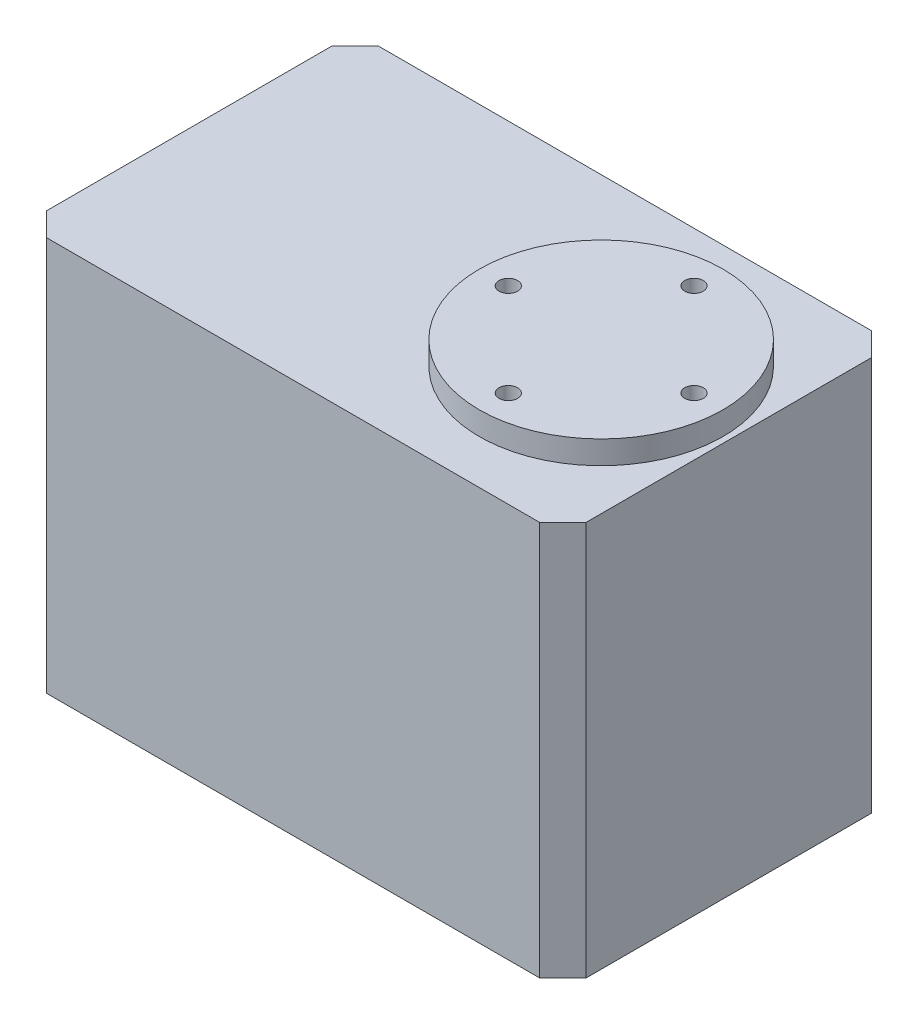
ISO-10303-21;
HEADER;
FILE_DESCRIPTION(('STEP AP214'),'2;1');
FILE_NAME('part.step','',(''),(''),'','','');
FILE_SCHEMA(('AUTOMOTIVE_DESIGN { 1 0 10303 214 1 1 1 1 }'));
ENDSEC;
DATA;
#1=APPLICATION_CONTEXT('core data for automotive mechanical design processes');
#2=APPLICATION_PROTOCOL_DEFINITION('international standard','automotive_design',2000,#1);
#3=PRODUCT_CONTEXT('',#1,'mechanical');
#4=PRODUCT('Part','Part','',(#3));
#5=PRODUCT_RELATED_PRODUCT_CATEGORY('part','',(#4));
#6=PRODUCT_DEFINITION_FORMATION('','',#4);
#7=PRODUCT_DEFINITION_CONTEXT('part definition',#1,'design');
#8=PRODUCT_DEFINITION('design','',#6,#7);
#9=PRODUCT_DEFINITION_SHAPE('','',#8);
#10=(LENGTH_UNIT() NAMED_UNIT(*) SI_UNIT(.MILLI.,.METRE.));
#11=(NAMED_UNIT(*) PLANE_ANGLE_UNIT() SI_UNIT($,.RADIAN.));
#12=(NAMED_UNIT(*) SI_UNIT($,.STERADIAN.) SOLID_ANGLE_UNIT());
#13=UNCERTAINTY_MEASURE_WITH_UNIT(LENGTH_MEASURE(1.E-05),#10,'distance_accuracy_value','');
#14=(GEOMETRIC_REPRESENTATION_CONTEXT(3) GLOBAL_UNCERTAINTY_ASSIGNED_CONTEXT((#13)) GLOBAL_UNIT_ASSIGNED_CONTEXT((#10,
#11,#12)) REPRESENTATION_CONTEXT('',''));
#15=CARTESIAN_POINT('',(0.,0.,0.));
#16=DIRECTION('',(0.,0.,1.));
#17=DIRECTION('',(1.,0.,0.));
#18=AXIS2_PLACEMENT_3D('',#15,#16,#17);
#19=CARTESIAN_POINT('',(23.25,34.,14.3));
#20=DIRECTION('',(-1.,0.,0.));
#21=DIRECTION('',(0.,0.,1.));
#22=AXIS2_PLACEMENT_3D('',#19,#20,#21);
#23=PLANE('',#22);
#24=DIRECTION('',(0.,0.,-1.));
#25=VECTOR('',#24,1.);
#26=CARTESIAN_POINT('',(23.25,0.,14.3));
#27=LINE('',#26,#25);
#28=CARTESIAN_POINT('',(23.25,0.,12.3));
#29=VERTEX_POINT('',#28);
#30=CARTESIAN_POINT('',(23.25,0.,-12.3));
#31=VERTEX_POINT('',#30);
#32=EDGE_CURVE('E155',#29,#31,#27,.T.);
#33=ORIENTED_EDGE('',*,*,#32,.T.);
#34=DIRECTION('',(0.,1.,0.));
#35=VECTOR('',#34,1.);
#36=CARTESIAN_POINT('',(23.25,34.,-12.3));
#37=LINE('',#36,#35);
#38=CARTESIAN_POINT('',(23.25,34.,-12.3));
#39=VERTEX_POINT('',#38);
#40=EDGE_CURVE('E50',#31,#39,#37,.T.);
#41=ORIENTED_EDGE('',*,*,#40,.T.);
#42=DIRECTION('',(0.,0.,-1.));
#43=VECTOR('',#42,1.);
#44=CARTESIAN_POINT('',(23.25,34.,14.3));
#45=LINE('',#44,#43);
#46=CARTESIAN_POINT('',(23.25,34.,12.3));
#47=VERTEX_POINT('',#46);
#48=EDGE_CURVE('E156',#47,#39,#45,.T.);
#49=ORIENTED_EDGE('',*,*,#48,.F.);
#50=DIRECTION('',(0.,-1.,0.));
#51=VECTOR('',#50,1.);
#52=CARTESIAN_POINT('',(23.25,34.,12.3));
#53=LINE('',#52,#51);
#54=EDGE_CURVE('E205',#47,#29,#53,.T.);
#55=ORIENTED_EDGE('',*,*,#54,.T.);
#56=EDGE_LOOP('',(#33,#41,#49,#55));
#57=FACE_BOUND('',#56,.T.);
#58=ADVANCED_FACE('F41',(#57),#23,.F.);
#59=CARTESIAN_POINT('',(-23.25,34.,-14.3));
#60=DIRECTION('',(0.,0.,1.));
#61=DIRECTION('',(1.,0.,0.));
#62=AXIS2_PLACEMENT_3D('',#59,#60,#61);
#63=PLANE('',#62);
#64=DIRECTION('',(-1.,0.,0.));
#65=VECTOR('',#64,1.);
#66=CARTESIAN_POINT('',(-23.25,0.,-14.3));
#67=LINE('',#66,#65);
#68=CARTESIAN_POINT('',(21.25,0.,-14.3));
#69=VERTEX_POINT('',#68);
#70=CARTESIAN_POINT('',(-21.25,0.,-14.3));
#71=VERTEX_POINT('',#70);
#72=EDGE_CURVE('E170',#69,#71,#67,.T.);
#73=ORIENTED_EDGE('',*,*,#72,.T.);
#74=DIRECTION('',(0.,1.,0.));
#75=VECTOR('',#74,1.);
#76=CARTESIAN_POINT('',(-21.25,34.,-14.3));
#77=LINE('',#76,#75);
#78=CARTESIAN_POINT('',(-21.25,34.,-14.3));
#79=VERTEX_POINT('',#78);
#80=EDGE_CURVE('E192',#71,#79,#77,.T.);
#81=ORIENTED_EDGE('',*,*,#80,.T.);
#82=DIRECTION('',(-1.,0.,0.));
#83=VECTOR('',#82,1.);
#84=CARTESIAN_POINT('',(-23.25,34.,-14.3));
#85=LINE('',#84,#83);
#86=CARTESIAN_POINT('',(21.25,34.,-14.3));
#87=VERTEX_POINT('',#86);
#88=EDGE_CURVE('E159',#87,#79,#85,.T.);
#89=ORIENTED_EDGE('',*,*,#88,.F.);
#90=DIRECTION('',(0.,-1.,0.));
#91=VECTOR('',#90,1.);
#92=CARTESIAN_POINT('',(21.25,34.,-14.3));
#93=LINE('',#92,#91);
#94=EDGE_CURVE('E189',#87,#69,#93,.T.);
#95=ORIENTED_EDGE('',*,*,#94,.T.);
#96=EDGE_LOOP('',(#73,#81,#89,#95));
#97=FACE_BOUND('',#96,.T.);
#98=ADVANCED_FACE('F221',(#97),#63,.F.);
#99=CARTESIAN_POINT('',(-23.25,34.,14.3));
#100=DIRECTION('',(1.,0.,0.));
#101=DIRECTION('',(0.,0.,-1.));
#102=AXIS2_PLACEMENT_3D('',#99,#100,#101);
#103=PLANE('',#102);
#104=DIRECTION('',(0.,0.,1.));
#105=VECTOR('',#104,1.);
#106=CARTESIAN_POINT('',(-23.25,34.,14.3));
#107=LINE('',#106,#105);
#108=CARTESIAN_POINT('',(-23.25,34.,-12.3));
#109=VERTEX_POINT('',#108);
#110=CARTESIAN_POINT('',(-23.25,34.,12.3));
#111=VERTEX_POINT('',#110);
#112=EDGE_CURVE('E163',#109,#111,#107,.T.);
#113=ORIENTED_EDGE('',*,*,#112,.F.);
#114=DIRECTION('',(0.,-1.,0.));
#115=VECTOR('',#114,1.);
#116=CARTESIAN_POINT('',(-23.25,34.,-12.3));
#117=LINE('',#116,#115);
#118=CARTESIAN_POINT('',(-23.25,0.,-12.3));
#119=VERTEX_POINT('',#118);
#120=EDGE_CURVE('E178',#109,#119,#117,.T.);
#121=ORIENTED_EDGE('',*,*,#120,.T.);
#122=DIRECTION('',(0.,0.,1.));
#123=VECTOR('',#122,1.);
#124=CARTESIAN_POINT('',(-23.25,0.,14.3));
#125=LINE('',#124,#123);
#126=CARTESIAN_POINT('',(-23.25,0.,12.3));
#127=VERTEX_POINT('',#126);
#128=EDGE_CURVE('E173',#119,#127,#125,.T.);
#129=ORIENTED_EDGE('',*,*,#128,.T.);
#130=DIRECTION('',(0.,1.,0.));
#131=VECTOR('',#130,1.);
#132=CARTESIAN_POINT('',(-23.25,34.,12.3));
#133=LINE('',#132,#131);
#134=EDGE_CURVE('E167',#127,#111,#133,.T.);
#135=ORIENTED_EDGE('',*,*,#134,.T.);
#136=EDGE_LOOP('',(#113,#121,#129,#135));
#137=FACE_BOUND('',#136,.T.);
#138=ADVANCED_FACE('F232',(#137),#103,.F.);
#139=CARTESIAN_POINT('',(-23.25,34.,14.3));
#140=DIRECTION('',(0.,0.,-1.));
#141=DIRECTION('',(-1.,0.,0.));
#142=AXIS2_PLACEMENT_3D('',#139,#140,#141);
#143=PLANE('',#142);
#144=DIRECTION('',(1.,0.,0.));
#145=VECTOR('',#144,1.);
#146=CARTESIAN_POINT('',(-23.25,34.,14.3));
#147=LINE('',#146,#145);
#148=CARTESIAN_POINT('',(-21.25,34.,14.3));
#149=VERTEX_POINT('',#148);
#150=CARTESIAN_POINT('',(21.25,34.,14.3));
#151=VERTEX_POINT('',#150);
#152=EDGE_CURVE('E165',#149,#151,#147,.T.);
#153=ORIENTED_EDGE('',*,*,#152,.F.);
#154=DIRECTION('',(0.,-1.,0.));
#155=VECTOR('',#154,1.);
#156=CARTESIAN_POINT('',(-21.25,34.,14.3));
#157=LINE('',#156,#155);
#158=CARTESIAN_POINT('',(-21.25,0.,14.3));
#159=VERTEX_POINT('',#158);
#160=EDGE_CURVE('E202',#149,#159,#157,.T.);
#161=ORIENTED_EDGE('',*,*,#160,.T.);
#162=DIRECTION('',(1.,0.,0.));
#163=VECTOR('',#162,1.);
#164=CARTESIAN_POINT('',(-23.25,0.,14.3));
#165=LINE('',#164,#163);
#166=CARTESIAN_POINT('',(21.25,0.,14.3));
#167=VERTEX_POINT('',#166);
#168=EDGE_CURVE('E160',#159,#167,#165,.T.);
#169=ORIENTED_EDGE('',*,*,#168,.T.);
#170=DIRECTION('',(0.,1.,0.));
#171=VECTOR('',#170,1.);
#172=CARTESIAN_POINT('',(21.25,34.,14.3));
#173=LINE('',#172,#171);
#174=EDGE_CURVE('E57',#167,#151,#173,.T.);
#175=ORIENTED_EDGE('',*,*,#174,.T.);
#176=EDGE_LOOP('',(#153,#161,#169,#175));
#177=FACE_BOUND('',#176,.T.);
#178=ADVANCED_FACE('F238',(#177),#143,.F.);
#179=CARTESIAN_POINT('',(0.,34.,0.));
#180=DIRECTION('',(0.,-1.,0.));
#181=DIRECTION('',(0.,0.,-1.));
#182=AXIS2_PLACEMENT_3D('',#179,#180,#181);
#183=PLANE('',#182);
#184=CARTESIAN_POINT('',(12.25,34.,0.));
#185=DIRECTION('',(0.,-1.,0.));
#186=DIRECTION('',(0.,0.,-1.));
#187=AXIS2_PLACEMENT_3D('',#184,#185,#186);
#188=CIRCLE('',#187,10.5);
#189=CARTESIAN_POINT('',(12.25,34.,-10.5));
#190=VERTEX_POINT('',#189);
#191=EDGE_CURVE('E11',#190,#190,#188,.F.);
#192=ORIENTED_EDGE('',*,*,#191,.F.);
#193=EDGE_LOOP('',(#192));
#194=FACE_BOUND('',#193,.T.);
#195=ORIENTED_EDGE('',*,*,#88,.T.);
#196=DIRECTION('',(0.707106781186548,0.,-0.707106781186547));
#197=VECTOR('',#196,1.);
#198=CARTESIAN_POINT('',(-23.25,34.,-12.3));
#199=LINE('',#198,#197);
#200=EDGE_CURVE('E199',#79,#109,#199,.F.);
#201=ORIENTED_EDGE('',*,*,#200,.T.);
#202=ORIENTED_EDGE('',*,*,#112,.T.);
#203=DIRECTION('',(-0.707106781186548,0.,-0.707106781186548));
#204=VECTOR('',#203,1.);
#205=CARTESIAN_POINT('',(-21.25,34.,14.3));
#206=LINE('',#205,#204);
#207=EDGE_CURVE('E64',#111,#149,#206,.F.);
#208=ORIENTED_EDGE('',*,*,#207,.T.);
#209=ORIENTED_EDGE('',*,*,#152,.T.);
#210=DIRECTION('',(-0.707106781186548,0.,0.707106781186548));
#211=VECTOR('',#210,1.);
#212=CARTESIAN_POINT('',(23.25,34.,12.3));
#213=LINE('',#212,#211);
#214=EDGE_CURVE('E194',#151,#47,#213,.F.);
#215=ORIENTED_EDGE('',*,*,#214,.T.);
#216=ORIENTED_EDGE('',*,*,#48,.T.);
#217=DIRECTION('',(0.707106781186548,0.,0.707106781186547));
#218=VECTOR('',#217,1.);
#219=CARTESIAN_POINT('',(21.25,34.,-14.3));
#220=LINE('',#219,#218);
#221=EDGE_CURVE('E196',#39,#87,#220,.F.);
#222=ORIENTED_EDGE('',*,*,#221,.T.);
#223=EDGE_LOOP('',(#195,#201,#202,#208,#209,#215,#216,#222));
#224=FACE_BOUND('',#223,.T.);
#225=ADVANCED_FACE('F214',(#194,#224),#183,.F.);
#226=CARTESIAN_POINT('',(0.,0.,0.));
#227=DIRECTION('',(0.,-1.,0.));
#228=DIRECTION('',(0.,0.,-1.));
#229=AXIS2_PLACEMENT_3D('',#226,#227,#228);
#230=PLANE('',#229);
#231=ORIENTED_EDGE('',*,*,#128,.F.);
#232=DIRECTION('',(-0.707106781186548,0.,0.707106781186547));
#233=VECTOR('',#232,1.);
#234=CARTESIAN_POINT('',(-17.775,0.,-17.775));
#235=LINE('',#234,#233);
#236=EDGE_CURVE('E187',#119,#71,#235,.F.);
#237=ORIENTED_EDGE('',*,*,#236,.T.);
#238=ORIENTED_EDGE('',*,*,#72,.F.);
#239=DIRECTION('',(-0.707106781186548,0.,-0.707106781186547));
#240=VECTOR('',#239,1.);
#241=CARTESIAN_POINT('',(17.775,0.,-17.775));
#242=LINE('',#241,#240);
#243=EDGE_CURVE('E183',#69,#31,#242,.F.);
#244=ORIENTED_EDGE('',*,*,#243,.T.);
#245=ORIENTED_EDGE('',*,*,#32,.F.);
#246=DIRECTION('',(0.707106781186548,0.,-0.707106781186548));
#247=VECTOR('',#246,1.);
#248=CARTESIAN_POINT('',(17.775,0.,17.775));
#249=LINE('',#248,#247);
#250=EDGE_CURVE('E181',#29,#167,#249,.F.);
#251=ORIENTED_EDGE('',*,*,#250,.T.);
#252=ORIENTED_EDGE('',*,*,#168,.F.);
#253=DIRECTION('',(0.707106781186548,0.,0.707106781186548));
#254=VECTOR('',#253,1.);
#255=CARTESIAN_POINT('',(-17.775,0.,17.775));
#256=LINE('',#255,#254);
#257=EDGE_CURVE('E185',#159,#127,#256,.F.);
#258=ORIENTED_EDGE('',*,*,#257,.T.);
#259=EDGE_LOOP('',(#231,#237,#238,#244,#245,#251,#252,#258));
#260=FACE_BOUND('',#259,.T.);
#261=ADVANCED_FACE('F225',(#260),#230,.T.);
#262=CARTESIAN_POINT('',(-23.25,34.,-12.3));
#263=DIRECTION('',(0.707106781186547,0.,0.707106781186548));
#264=DIRECTION('',(0.,-1.,0.));
#265=AXIS2_PLACEMENT_3D('',#262,#263,#264);
#266=PLANE('',#265);
#267=ORIENTED_EDGE('',*,*,#200,.F.);
#268=ORIENTED_EDGE('',*,*,#80,.F.);
#269=ORIENTED_EDGE('',*,*,#236,.F.);
#270=ORIENTED_EDGE('',*,*,#120,.F.);
#271=EDGE_LOOP('',(#267,#268,#269,#270));
#272=FACE_BOUND('',#271,.T.);
#273=ADVANCED_FACE('F229',(#272),#266,.F.);
#274=CARTESIAN_POINT('',(-21.25,34.,14.3));
#275=DIRECTION('',(0.707106781186547,0.,-0.707106781186547));
#276=DIRECTION('',(0.,-1.,0.));
#277=AXIS2_PLACEMENT_3D('',#274,#275,#276);
#278=PLANE('',#277);
#279=ORIENTED_EDGE('',*,*,#207,.F.);
#280=ORIENTED_EDGE('',*,*,#134,.F.);
#281=ORIENTED_EDGE('',*,*,#257,.F.);
#282=ORIENTED_EDGE('',*,*,#160,.F.);
#283=EDGE_LOOP('',(#279,#280,#281,#282));
#284=FACE_BOUND('',#283,.T.);
#285=ADVANCED_FACE('F236',(#284),#278,.F.);
#286=CARTESIAN_POINT('',(21.25,34.,-14.3));
#287=DIRECTION('',(-0.707106781186547,0.,0.707106781186548));
#288=DIRECTION('',(0.,-1.,0.));
#289=AXIS2_PLACEMENT_3D('',#286,#287,#288);
#290=PLANE('',#289);
#291=ORIENTED_EDGE('',*,*,#221,.F.);
#292=ORIENTED_EDGE('',*,*,#40,.F.);
#293=ORIENTED_EDGE('',*,*,#243,.F.);
#294=ORIENTED_EDGE('',*,*,#94,.F.);
#295=EDGE_LOOP('',(#291,#292,#293,#294));
#296=FACE_BOUND('',#295,.T.);
#297=ADVANCED_FACE('F218',(#296),#290,.F.);
#298=CARTESIAN_POINT('',(23.25,34.,12.3));
#299=DIRECTION('',(-0.707106781186547,0.,-0.707106781186547));
#300=DIRECTION('',(0.,-1.,0.));
#301=AXIS2_PLACEMENT_3D('',#298,#299,#300);
#302=PLANE('',#301);
#303=ORIENTED_EDGE('',*,*,#214,.F.);
#304=ORIENTED_EDGE('',*,*,#174,.F.);
#305=ORIENTED_EDGE('',*,*,#250,.F.);
#306=ORIENTED_EDGE('',*,*,#54,.F.);
#307=EDGE_LOOP('',(#303,#304,#305,#306));
#308=FACE_BOUND('',#307,.T.);
#309=ADVANCED_FACE('F44',(#308),#302,.F.);
#310=CARTESIAN_POINT('',(12.25,36.,0.));
#311=DIRECTION('',(0.,-1.,0.));
#312=DIRECTION('',(0.,0.,-1.));
#313=AXIS2_PLACEMENT_3D('',#310,#311,#312);
#314=CYLINDRICAL_SURFACE('',#313,10.5);
#315=CARTESIAN_POINT('',(12.25,36.,0.));
#316=DIRECTION('',(0.,1.,0.));
#317=DIRECTION('',(0.,0.,1.));
#318=AXIS2_PLACEMENT_3D('',#315,#316,#317);
#319=CIRCLE('',#318,10.5);
#320=CARTESIAN_POINT('',(12.25,36.,10.5));
#321=VERTEX_POINT('',#320);
#322=EDGE_CURVE('E152',#321,#321,#319,.T.);
#323=ORIENTED_EDGE('',*,*,#322,.F.);
#324=EDGE_LOOP('',(#323));
#325=FACE_BOUND('',#324,.T.);
#326=ORIENTED_EDGE('',*,*,#191,.T.);
#327=EDGE_LOOP('',(#326));
#328=FACE_BOUND('',#327,.T.);
#329=ADVANCED_FACE('F241',(#325,#328),#314,.T.);
#330=CARTESIAN_POINT('',(12.25,36.,0.));
#331=DIRECTION('',(0.,1.,0.));
#332=DIRECTION('',(0.,0.,1.));
#333=AXIS2_PLACEMENT_3D('',#330,#331,#332);
#334=PLANE('',#333);
#335=CARTESIAN_POINT('',(12.25,36.,-8.));
#336=DIRECTION('',(0.,1.,0.));
#337=DIRECTION('',(0.,0.,1.));
#338=AXIS2_PLACEMENT_3D('',#335,#336,#337);
#339=CIRCLE('',#338,0.79999999999999);
#340=CARTESIAN_POINT('',(12.25,36.,-7.20000000000001));
#341=VERTEX_POINT('',#340);
#342=EDGE_CURVE('E130',#341,#341,#339,.T.);
#343=ORIENTED_EDGE('',*,*,#342,.F.);
#344=EDGE_LOOP('',(#343));
#345=FACE_BOUND('',#344,.T.);
#346=CARTESIAN_POINT('',(20.25,36.,0.));
#347=DIRECTION('',(0.,1.,0.));
#348=DIRECTION('',(0.,0.,1.));
#349=AXIS2_PLACEMENT_3D('',#346,#347,#348);
#350=CIRCLE('',#349,0.799999999999988);
#351=CARTESIAN_POINT('',(20.25,36.,0.799999999999988));
#352=VERTEX_POINT('',#351);
#353=EDGE_CURVE('E129',#352,#352,#350,.T.);
#354=ORIENTED_EDGE('',*,*,#353,.F.);
#355=EDGE_LOOP('',(#354));
#356=FACE_BOUND('',#355,.T.);
#357=CARTESIAN_POINT('',(12.25,36.,8.));
#358=DIRECTION('',(0.,1.,0.));
#359=DIRECTION('',(0.,0.,1.));
#360=AXIS2_PLACEMENT_3D('',#357,#358,#359);
#361=CIRCLE('',#360,0.79999999999999);
#362=CARTESIAN_POINT('',(12.25,36.,8.79999999999999));
#363=VERTEX_POINT('',#362);
#364=EDGE_CURVE('E140',#363,#363,#361,.T.);
#365=ORIENTED_EDGE('',*,*,#364,.F.);
#366=EDGE_LOOP('',(#365));
#367=FACE_BOUND('',#366,.T.);
#368=CARTESIAN_POINT('',(4.25,36.,0.));
#369=DIRECTION('',(0.,1.,0.));
#370=DIRECTION('',(0.,0.,1.));
#371=AXIS2_PLACEMENT_3D('',#368,#369,#370);
#372=CIRCLE('',#371,0.79999999999999);
#373=CARTESIAN_POINT('',(4.25,36.,0.79999999999999));
#374=VERTEX_POINT('',#373);
#375=EDGE_CURVE('E146',#374,#374,#372,.T.);
#376=ORIENTED_EDGE('',*,*,#375,.F.);
#377=EDGE_LOOP('',(#376));
#378=FACE_BOUND('',#377,.T.);
#379=ORIENTED_EDGE('',*,*,#322,.T.);
#380=EDGE_LOOP('',(#379));
#381=FACE_BOUND('',#380,.T.);
#382=ADVANCED_FACE('F246',(#345,#356,#367,#378,#381),#334,.T.);
#383=CARTESIAN_POINT('',(4.25,32.8,0.));
#384=DIRECTION('',(0.,1.,0.));
#385=DIRECTION('',(0.,0.,1.));
#386=AXIS2_PLACEMENT_3D('',#383,#384,#385);
#387=CONICAL_SURFACE('',#386,0.799999999999995,1.02974425867666);
#388=CARTESIAN_POINT('',(4.25,32.319311504778,0.));
#389=VERTEX_POINT('',#388);
#390=VERTEX_LOOP('',#389);
#391=FACE_BOUND('',#390,.T.);
#392=CARTESIAN_POINT('',(4.25,32.8,0.));
#393=DIRECTION('',(0.,1.,0.));
#394=DIRECTION('',(0.,0.,1.));
#395=AXIS2_PLACEMENT_3D('',#392,#393,#394);
#396=CIRCLE('',#395,0.799999999999995);
#397=CARTESIAN_POINT('',(4.25,32.8,0.799999999999995));
#398=VERTEX_POINT('',#397);
#399=EDGE_CURVE('E149',#398,#398,#396,.T.);
#400=ORIENTED_EDGE('',*,*,#399,.T.);
#401=EDGE_LOOP('',(#400));
#402=FACE_BOUND('',#401,.T.);
#403=ADVANCED_FACE('F312',(#391,#402),#387,.F.);
#404=CARTESIAN_POINT('',(4.25,36.,0.));
#405=DIRECTION('',(0.,1.,0.));
#406=DIRECTION('',(0.,0.,1.));
#407=AXIS2_PLACEMENT_3D('',#404,#405,#406);
#408=CYLINDRICAL_SURFACE('',#407,0.799999999999993);
#409=ORIENTED_EDGE('',*,*,#399,.F.);
#410=EDGE_LOOP('',(#409));
#411=FACE_BOUND('',#410,.T.);
#412=ORIENTED_EDGE('',*,*,#375,.T.);
#413=EDGE_LOOP('',(#412));
#414=FACE_BOUND('',#413,.T.);
#415=ADVANCED_FACE('F324',(#411,#414),#408,.F.);
#416=CARTESIAN_POINT('',(12.25,32.8,8.));
#417=DIRECTION('',(0.,1.,0.));
#418=DIRECTION('',(0.,0.,1.));
#419=AXIS2_PLACEMENT_3D('',#416,#417,#418);
#420=CONICAL_SURFACE('',#419,0.799999999999995,1.02974425867665);
#421=CARTESIAN_POINT('',(12.25,32.319311504778,8.));
#422=VERTEX_POINT('',#421);
#423=VERTEX_LOOP('',#422);
#424=FACE_BOUND('',#423,.T.);
#425=CARTESIAN_POINT('',(12.25,32.8,8.));
#426=DIRECTION('',(0.,1.,0.));
#427=DIRECTION('',(0.,0.,1.));
#428=AXIS2_PLACEMENT_3D('',#425,#426,#427);
#429=CIRCLE('',#428,0.799999999999995);
#430=CARTESIAN_POINT('',(12.25,32.8,8.8));
#431=VERTEX_POINT('',#430);
#432=EDGE_CURVE('E143',#431,#431,#429,.T.);
#433=ORIENTED_EDGE('',*,*,#432,.T.);
#434=EDGE_LOOP('',(#433));
#435=FACE_BOUND('',#434,.T.);
#436=ADVANCED_FACE('F335',(#424,#435),#420,.F.);
#437=CARTESIAN_POINT('',(12.25,36.,8.));
#438=DIRECTION('',(0.,1.,0.));
#439=DIRECTION('',(0.,0.,1.));
#440=AXIS2_PLACEMENT_3D('',#437,#438,#439);
#441=CYLINDRICAL_SURFACE('',#440,0.799999999999993);
#442=ORIENTED_EDGE('',*,*,#432,.F.);
#443=EDGE_LOOP('',(#442));
#444=FACE_BOUND('',#443,.T.);
#445=ORIENTED_EDGE('',*,*,#364,.T.);
#446=EDGE_LOOP('',(#445));
#447=FACE_BOUND('',#446,.T.);
#448=ADVANCED_FACE('F347',(#444,#447),#441,.F.);
#449=CARTESIAN_POINT('',(20.25,32.8,0.));
#450=DIRECTION('',(0.,1.,0.));
#451=DIRECTION('',(0.,0.,1.));
#452=AXIS2_PLACEMENT_3D('',#449,#450,#451);
#453=CONICAL_SURFACE('',#452,0.799999999999995,1.02974425867666);
#454=CARTESIAN_POINT('',(20.25,32.319311504778,0.));
#455=VERTEX_POINT('',#454);
#456=VERTEX_LOOP('',#455);
#457=FACE_BOUND('',#456,.T.);
#458=CARTESIAN_POINT('',(20.25,32.8,0.));
#459=DIRECTION('',(0.,1.,0.));
#460=DIRECTION('',(0.,0.,1.));
#461=AXIS2_PLACEMENT_3D('',#458,#459,#460);
#462=CIRCLE('',#461,0.799999999999995);
#463=CARTESIAN_POINT('',(20.25,32.8,0.799999999999995));
#464=VERTEX_POINT('',#463);
#465=EDGE_CURVE('E133',#464,#464,#462,.T.);
#466=ORIENTED_EDGE('',*,*,#465,.T.);
#467=EDGE_LOOP('',(#466));
#468=FACE_BOUND('',#467,.T.);
#469=ADVANCED_FACE('F357',(#457,#468),#453,.F.);
#470=CARTESIAN_POINT('',(20.25,36.,0.));
#471=DIRECTION('',(0.,1.,0.));
#472=DIRECTION('',(0.,0.,1.));
#473=AXIS2_PLACEMENT_3D('',#470,#471,#472);
#474=CYLINDRICAL_SURFACE('',#473,0.799999999999992);
#475=ORIENTED_EDGE('',*,*,#465,.F.);
#476=EDGE_LOOP('',(#475));
#477=FACE_BOUND('',#476,.T.);
#478=ORIENTED_EDGE('',*,*,#353,.T.);
#479=EDGE_LOOP('',(#478));
#480=FACE_BOUND('',#479,.T.);
#481=ADVANCED_FACE('F123',(#477,#480),#474,.F.);
#482=CARTESIAN_POINT('',(12.25,32.8,-8.));
#483=DIRECTION('',(0.,1.,0.));
#484=DIRECTION('',(0.,0.,1.));
#485=AXIS2_PLACEMENT_3D('',#482,#483,#484);
#486=CONICAL_SURFACE('',#485,0.799999999999995,1.02974425867665);
#487=CARTESIAN_POINT('',(12.25,32.319311504778,-8.));
#488=VERTEX_POINT('',#487);
#489=VERTEX_LOOP('',#488);
#490=FACE_BOUND('',#489,.T.);
#491=CARTESIAN_POINT('',(12.25,32.8,-8.));
#492=DIRECTION('',(0.,1.,0.));
#493=DIRECTION('',(0.,0.,1.));
#494=AXIS2_PLACEMENT_3D('',#491,#492,#493);
#495=CIRCLE('',#494,0.799999999999995);
#496=CARTESIAN_POINT('',(12.25,32.8,-7.2));
#497=VERTEX_POINT('',#496);
#498=EDGE_CURVE('E127',#497,#497,#495,.T.);
#499=ORIENTED_EDGE('',*,*,#498,.T.);
#500=EDGE_LOOP('',(#499));
#501=FACE_BOUND('',#500,.T.);
#502=ADVANCED_FACE('F119',(#490,#501),#486,.F.);
#503=CARTESIAN_POINT('',(12.25,36.,-8.));
#504=DIRECTION('',(0.,1.,0.));
#505=DIRECTION('',(0.,0.,1.));
#506=AXIS2_PLACEMENT_3D('',#503,#504,#505);
#507=CYLINDRICAL_SURFACE('',#506,0.799999999999993);
#508=ORIENTED_EDGE('',*,*,#498,.F.);
#509=EDGE_LOOP('',(#508));
#510=FACE_BOUND('',#509,.T.);
#511=ORIENTED_EDGE('',*,*,#342,.T.);
#512=EDGE_LOOP('',(#511));
#513=FACE_BOUND('',#512,.T.);
#514=ADVANCED_FACE('F122',(#510,#513),#507,.F.);
#515=CLOSED_SHELL('',(#58,#98,#138,#178,#225,#261,#273,#285,#297,#309,#329,#382,#403,#415,#436,
#448,#469,#481,#502,#514));
#516=MANIFOLD_SOLID_BREP('B2',#515);
#517=ADVANCED_BREP_SHAPE_REPRESENTATION('',(#18,#516),#14);
#518=SHAPE_DEFINITION_REPRESENTATION(#9,#517);
ENDSEC;
END-ISO-10303-21;
